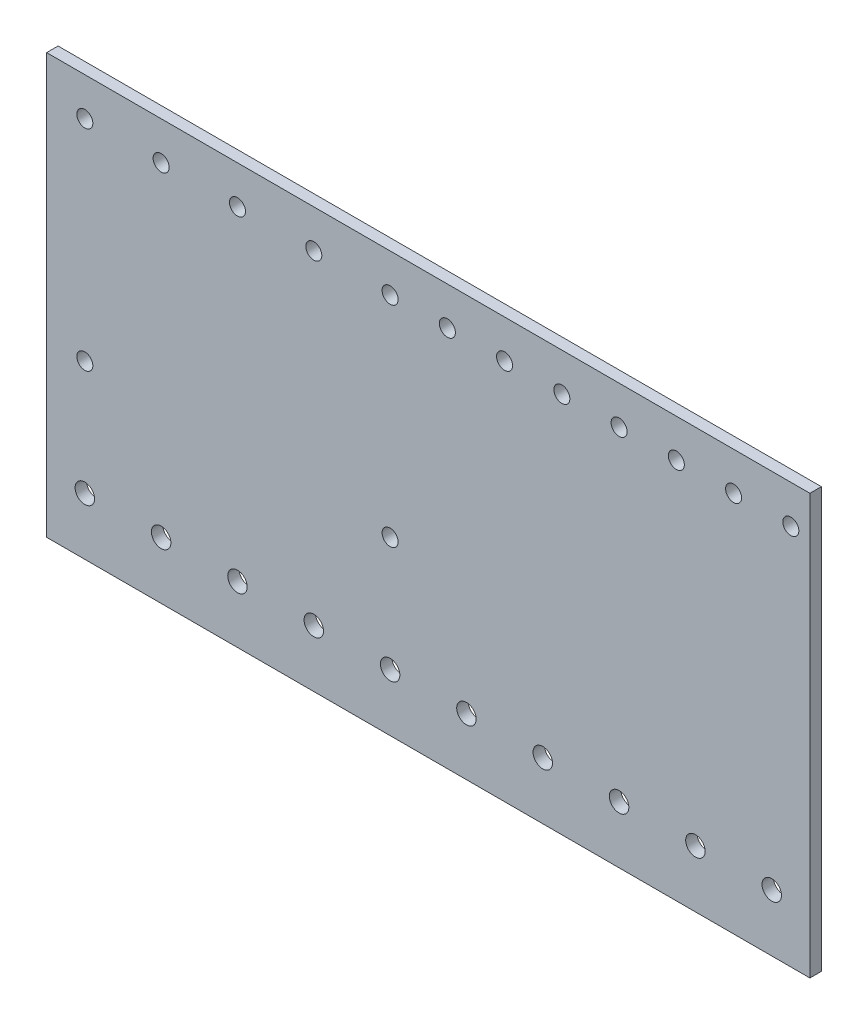
ISO-10303-21;
HEADER;
FILE_DESCRIPTION(('STEP AP214'),'2;1');
FILE_NAME('part.step','',(''),(''),'','','');
FILE_SCHEMA(('AUTOMOTIVE_DESIGN { 1 0 10303 214 1 1 1 1 }'));
ENDSEC;
DATA;
#1=APPLICATION_CONTEXT('core data for automotive mechanical design processes');
#2=APPLICATION_PROTOCOL_DEFINITION('international standard','automotive_design',2000,#1);
#3=PRODUCT_CONTEXT('',#1,'mechanical');
#4=PRODUCT('Part','Part','',(#3));
#5=PRODUCT_RELATED_PRODUCT_CATEGORY('part','',(#4));
#6=PRODUCT_DEFINITION_FORMATION('','',#4);
#7=PRODUCT_DEFINITION_CONTEXT('part definition',#1,'design');
#8=PRODUCT_DEFINITION('design','',#6,#7);
#9=PRODUCT_DEFINITION_SHAPE('','',#8);
#10=(LENGTH_UNIT() NAMED_UNIT(*) SI_UNIT(.MILLI.,.METRE.));
#11=(NAMED_UNIT(*) PLANE_ANGLE_UNIT() SI_UNIT($,.RADIAN.));
#12=(NAMED_UNIT(*) SI_UNIT($,.STERADIAN.) SOLID_ANGLE_UNIT());
#13=UNCERTAINTY_MEASURE_WITH_UNIT(LENGTH_MEASURE(1.E-05),#10,'distance_accuracy_value','');
#14=(GEOMETRIC_REPRESENTATION_CONTEXT(3) GLOBAL_UNCERTAINTY_ASSIGNED_CONTEXT((#13)) GLOBAL_UNIT_ASSIGNED_CONTEXT((#10,
#11,#12)) REPRESENTATION_CONTEXT('',''));
#15=CARTESIAN_POINT('',(0.,0.,0.));
#16=DIRECTION('',(0.,0.,1.));
#17=DIRECTION('',(1.,0.,0.));
#18=AXIS2_PLACEMENT_3D('',#15,#16,#17);
#19=CARTESIAN_POINT('',(0.,0.,3.));
#20=DIRECTION('',(0.,0.,1.));
#21=DIRECTION('',(1.,0.,0.));
#22=AXIS2_PLACEMENT_3D('',#19,#20,#21);
#23=PLANE('',#22);
#24=DIRECTION('',(1.,0.,0.));
#25=VECTOR('',#24,1.);
#26=CARTESIAN_POINT('',(150.,-45.,3.));
#27=LINE('',#26,#25);
#28=CARTESIAN_POINT('',(-50.,-45.,3.));
#29=VERTEX_POINT('',#28);
#30=CARTESIAN_POINT('',(150.,-45.,3.));
#31=VERTEX_POINT('',#30);
#32=EDGE_CURVE('E83',#29,#31,#27,.T.);
#33=ORIENTED_EDGE('',*,*,#32,.T.);
#34=DIRECTION('',(0.,1.,0.));
#35=VECTOR('',#34,1.);
#36=CARTESIAN_POINT('',(150.,-65.,3.));
#37=LINE('',#36,#35);
#38=CARTESIAN_POINT('',(150.,65.,3.));
#39=VERTEX_POINT('',#38);
#40=EDGE_CURVE('E199',#31,#39,#37,.T.);
#41=ORIENTED_EDGE('',*,*,#40,.T.);
#42=DIRECTION('',(-1.,0.,0.));
#43=VECTOR('',#42,1.);
#44=CARTESIAN_POINT('',(-50.,65.,3.));
#45=LINE('',#44,#43);
#46=CARTESIAN_POINT('',(-50.,65.,3.));
#47=VERTEX_POINT('',#46);
#48=EDGE_CURVE('E67',#39,#47,#45,.T.);
#49=ORIENTED_EDGE('',*,*,#48,.T.);
#50=DIRECTION('',(0.,-1.,0.));
#51=VECTOR('',#50,1.);
#52=CARTESIAN_POINT('',(-50.,65.,3.));
#53=LINE('',#52,#51);
#54=EDGE_CURVE('E50',#47,#29,#53,.T.);
#55=ORIENTED_EDGE('',*,*,#54,.T.);
#56=EDGE_LOOP('',(#33,#41,#49,#55));
#57=FACE_BOUND('',#56,.T.);
#58=CARTESIAN_POINT('',(140.,-30.,3.));
#59=DIRECTION('',(0.,0.,-1.));
#60=DIRECTION('',(-1.,0.,0.));
#61=AXIS2_PLACEMENT_3D('',#58,#59,#60);
#62=CIRCLE('',#61,2.54999999999999);
#63=CARTESIAN_POINT('',(137.45,-30.,3.));
#64=VERTEX_POINT('',#63);
#65=EDGE_CURVE('E117',#64,#64,#62,.T.);
#66=ORIENTED_EDGE('',*,*,#65,.T.);
#67=EDGE_LOOP('',(#66));
#68=FACE_BOUND('',#67,.T.);
#69=CARTESIAN_POINT('',(120.,-30.,3.));
#70=DIRECTION('',(0.,0.,-1.));
#71=DIRECTION('',(-1.,0.,0.));
#72=AXIS2_PLACEMENT_3D('',#69,#70,#71);
#73=CIRCLE('',#72,2.54999999999999);
#74=CARTESIAN_POINT('',(117.45,-30.,3.));
#75=VERTEX_POINT('',#74);
#76=EDGE_CURVE('E314',#75,#75,#73,.T.);
#77=ORIENTED_EDGE('',*,*,#76,.T.);
#78=EDGE_LOOP('',(#77));
#79=FACE_BOUND('',#78,.T.);
#80=CARTESIAN_POINT('',(100.,-30.,3.));
#81=DIRECTION('',(0.,0.,-1.));
#82=DIRECTION('',(-1.,0.,0.));
#83=AXIS2_PLACEMENT_3D('',#80,#81,#82);
#84=CIRCLE('',#83,2.54999999999999);
#85=CARTESIAN_POINT('',(97.45,-30.,3.));
#86=VERTEX_POINT('',#85);
#87=EDGE_CURVE('E318',#86,#86,#84,.T.);
#88=ORIENTED_EDGE('',*,*,#87,.T.);
#89=EDGE_LOOP('',(#88));
#90=FACE_BOUND('',#89,.T.);
#91=CARTESIAN_POINT('',(80.,-30.,3.));
#92=DIRECTION('',(0.,0.,-1.));
#93=DIRECTION('',(-1.,0.,0.));
#94=AXIS2_PLACEMENT_3D('',#91,#92,#93);
#95=CIRCLE('',#94,2.54999999999999);
#96=CARTESIAN_POINT('',(77.45,-30.,3.));
#97=VERTEX_POINT('',#96);
#98=EDGE_CURVE('E322',#97,#97,#95,.T.);
#99=ORIENTED_EDGE('',*,*,#98,.T.);
#100=EDGE_LOOP('',(#99));
#101=FACE_BOUND('',#100,.T.);
#102=CARTESIAN_POINT('',(60.,-30.,3.));
#103=DIRECTION('',(0.,0.,-1.));
#104=DIRECTION('',(-1.,0.,0.));
#105=AXIS2_PLACEMENT_3D('',#102,#103,#104);
#106=CIRCLE('',#105,2.54999999999999);
#107=CARTESIAN_POINT('',(57.45,-30.,3.));
#108=VERTEX_POINT('',#107);
#109=EDGE_CURVE('E326',#108,#108,#106,.T.);
#110=ORIENTED_EDGE('',*,*,#109,.T.);
#111=EDGE_LOOP('',(#110));
#112=FACE_BOUND('',#111,.T.);
#113=CARTESIAN_POINT('',(40.,-30.,3.));
#114=DIRECTION('',(0.,0.,-1.));
#115=DIRECTION('',(-1.,0.,0.));
#116=AXIS2_PLACEMENT_3D('',#113,#114,#115);
#117=CIRCLE('',#116,2.54999999999999);
#118=CARTESIAN_POINT('',(37.45,-30.,3.));
#119=VERTEX_POINT('',#118);
#120=EDGE_CURVE('E330',#119,#119,#117,.T.);
#121=ORIENTED_EDGE('',*,*,#120,.T.);
#122=EDGE_LOOP('',(#121));
#123=FACE_BOUND('',#122,.T.);
#124=CARTESIAN_POINT('',(20.,-30.,3.));
#125=DIRECTION('',(0.,0.,-1.));
#126=DIRECTION('',(-1.,0.,0.));
#127=AXIS2_PLACEMENT_3D('',#124,#125,#126);
#128=CIRCLE('',#127,2.54999999999999);
#129=CARTESIAN_POINT('',(17.45,-30.,3.));
#130=VERTEX_POINT('',#129);
#131=EDGE_CURVE('E334',#130,#130,#128,.T.);
#132=ORIENTED_EDGE('',*,*,#131,.T.);
#133=EDGE_LOOP('',(#132));
#134=FACE_BOUND('',#133,.T.);
#135=CARTESIAN_POINT('',(0.,-30.,3.));
#136=DIRECTION('',(0.,0.,-1.));
#137=DIRECTION('',(-1.,0.,0.));
#138=AXIS2_PLACEMENT_3D('',#135,#136,#137);
#139=CIRCLE('',#138,2.54999999999999);
#140=CARTESIAN_POINT('',(-2.54999999999999,-30.,3.));
#141=VERTEX_POINT('',#140);
#142=EDGE_CURVE('E338',#141,#141,#139,.T.);
#143=ORIENTED_EDGE('',*,*,#142,.T.);
#144=EDGE_LOOP('',(#143));
#145=FACE_BOUND('',#144,.T.);
#146=CARTESIAN_POINT('',(-20.,-30.,3.));
#147=DIRECTION('',(0.,0.,-1.));
#148=DIRECTION('',(-1.,0.,0.));
#149=AXIS2_PLACEMENT_3D('',#146,#147,#148);
#150=CIRCLE('',#149,2.54999999999999);
#151=CARTESIAN_POINT('',(-22.55,-30.,3.));
#152=VERTEX_POINT('',#151);
#153=EDGE_CURVE('E307',#152,#152,#150,.T.);
#154=ORIENTED_EDGE('',*,*,#153,.T.);
#155=EDGE_LOOP('',(#154));
#156=FACE_BOUND('',#155,.T.);
#157=CARTESIAN_POINT('',(-40.,-30.,3.));
#158=DIRECTION('',(0.,0.,-1.));
#159=DIRECTION('',(-1.,0.,0.));
#160=AXIS2_PLACEMENT_3D('',#157,#158,#159);
#161=CIRCLE('',#160,2.54999999999999);
#162=CARTESIAN_POINT('',(-42.55,-30.,3.));
#163=VERTEX_POINT('',#162);
#164=EDGE_CURVE('E302',#163,#163,#161,.T.);
#165=ORIENTED_EDGE('',*,*,#164,.T.);
#166=EDGE_LOOP('',(#165));
#167=FACE_BOUND('',#166,.T.);
#168=CARTESIAN_POINT('',(69.9999999999994,55.,3.));
#169=DIRECTION('',(0.,0.,1.));
#170=DIRECTION('',(1.,0.,0.));
#171=AXIS2_PLACEMENT_3D('',#168,#169,#170);
#172=CIRCLE('',#171,2.09999999999999);
#173=CARTESIAN_POINT('',(72.0999999999994,55.,3.));
#174=VERTEX_POINT('',#173);
#175=EDGE_CURVE('E195',#174,#174,#172,.T.);
#176=ORIENTED_EDGE('',*,*,#175,.F.);
#177=EDGE_LOOP('',(#176));
#178=FACE_BOUND('',#177,.T.);
#179=CARTESIAN_POINT('',(84.9999999999994,55.,3.));
#180=DIRECTION('',(0.,0.,1.));
#181=DIRECTION('',(1.,0.,0.));
#182=AXIS2_PLACEMENT_3D('',#179,#180,#181);
#183=CIRCLE('',#182,2.09999999999999);
#184=CARTESIAN_POINT('',(87.0999999999994,55.,3.));
#185=VERTEX_POINT('',#184);
#186=EDGE_CURVE('E191',#185,#185,#183,.T.);
#187=ORIENTED_EDGE('',*,*,#186,.F.);
#188=EDGE_LOOP('',(#187));
#189=FACE_BOUND('',#188,.T.);
#190=CARTESIAN_POINT('',(99.9999999999994,55.,3.));
#191=DIRECTION('',(0.,0.,1.));
#192=DIRECTION('',(1.,0.,0.));
#193=AXIS2_PLACEMENT_3D('',#190,#191,#192);
#194=CIRCLE('',#193,2.09999999999999);
#195=CARTESIAN_POINT('',(102.099999999999,55.,3.));
#196=VERTEX_POINT('',#195);
#197=EDGE_CURVE('E187',#196,#196,#194,.T.);
#198=ORIENTED_EDGE('',*,*,#197,.F.);
#199=EDGE_LOOP('',(#198));
#200=FACE_BOUND('',#199,.T.);
#201=CARTESIAN_POINT('',(114.999999999999,55.,3.));
#202=DIRECTION('',(0.,0.,1.));
#203=DIRECTION('',(1.,0.,0.));
#204=AXIS2_PLACEMENT_3D('',#201,#202,#203);
#205=CIRCLE('',#204,2.09999999999999);
#206=CARTESIAN_POINT('',(117.099999999999,55.,3.));
#207=VERTEX_POINT('',#206);
#208=EDGE_CURVE('E183',#207,#207,#205,.T.);
#209=ORIENTED_EDGE('',*,*,#208,.F.);
#210=EDGE_LOOP('',(#209));
#211=FACE_BOUND('',#210,.T.);
#212=CARTESIAN_POINT('',(129.999999999999,55.,3.));
#213=DIRECTION('',(0.,0.,1.));
#214=DIRECTION('',(1.,0.,0.));
#215=AXIS2_PLACEMENT_3D('',#212,#213,#214);
#216=CIRCLE('',#215,2.09999999999999);
#217=CARTESIAN_POINT('',(132.099999999999,55.,3.));
#218=VERTEX_POINT('',#217);
#219=EDGE_CURVE('E179',#218,#218,#216,.T.);
#220=ORIENTED_EDGE('',*,*,#219,.F.);
#221=EDGE_LOOP('',(#220));
#222=FACE_BOUND('',#221,.T.);
#223=CARTESIAN_POINT('',(144.999999999999,55.,3.));
#224=DIRECTION('',(0.,0.,1.));
#225=DIRECTION('',(1.,0.,0.));
#226=AXIS2_PLACEMENT_3D('',#223,#224,#225);
#227=CIRCLE('',#226,2.09999999999999);
#228=CARTESIAN_POINT('',(147.099999999999,55.,3.));
#229=VERTEX_POINT('',#228);
#230=EDGE_CURVE('E175',#229,#229,#227,.T.);
#231=ORIENTED_EDGE('',*,*,#230,.F.);
#232=EDGE_LOOP('',(#231));
#233=FACE_BOUND('',#232,.T.);
#234=CARTESIAN_POINT('',(54.9999999999994,55.,3.));
#235=DIRECTION('',(0.,0.,1.));
#236=DIRECTION('',(1.,0.,0.));
#237=AXIS2_PLACEMENT_3D('',#234,#235,#236);
#238=CIRCLE('',#237,2.09999999999999);
#239=CARTESIAN_POINT('',(57.0999999999994,55.,3.));
#240=VERTEX_POINT('',#239);
#241=EDGE_CURVE('E170',#240,#240,#238,.T.);
#242=ORIENTED_EDGE('',*,*,#241,.F.);
#243=EDGE_LOOP('',(#242));
#244=FACE_BOUND('',#243,.T.);
#245=CARTESIAN_POINT('',(40.0000000000006,0.,3.));
#246=DIRECTION('',(0.,0.,-1.));
#247=DIRECTION('',(-1.,0.,0.));
#248=AXIS2_PLACEMENT_3D('',#245,#246,#247);
#249=CIRCLE('',#248,2.09999999999999);
#250=CARTESIAN_POINT('',(37.9000000000006,0.,3.));
#251=VERTEX_POINT('',#250);
#252=EDGE_CURVE('E109',#251,#251,#249,.T.);
#253=ORIENTED_EDGE('',*,*,#252,.T.);
#254=EDGE_LOOP('',(#253));
#255=FACE_BOUND('',#254,.T.);
#256=CARTESIAN_POINT('',(-5.759281940243E-13,55.,3.));
#257=DIRECTION('',(0.,0.,1.));
#258=DIRECTION('',(1.,0.,0.));
#259=AXIS2_PLACEMENT_3D('',#256,#257,#258);
#260=CIRCLE('',#259,2.09999999999999);
#261=CARTESIAN_POINT('',(2.09999999999941,55.,3.));
#262=VERTEX_POINT('',#261);
#263=EDGE_CURVE('E219',#262,#262,#260,.T.);
#264=ORIENTED_EDGE('',*,*,#263,.F.);
#265=EDGE_LOOP('',(#264));
#266=FACE_BOUND('',#265,.T.);
#267=CARTESIAN_POINT('',(-20.0000000000006,55.,3.));
#268=DIRECTION('',(0.,0.,1.));
#269=DIRECTION('',(1.,0.,0.));
#270=AXIS2_PLACEMENT_3D('',#267,#268,#269);
#271=CIRCLE('',#270,2.09999999999999);
#272=CARTESIAN_POINT('',(-17.9000000000006,55.,3.));
#273=VERTEX_POINT('',#272);
#274=EDGE_CURVE('E228',#273,#273,#271,.T.);
#275=ORIENTED_EDGE('',*,*,#274,.F.);
#276=EDGE_LOOP('',(#275));
#277=FACE_BOUND('',#276,.T.);
#278=CARTESIAN_POINT('',(-40.0000000000006,54.9999999999992,3.));
#279=DIRECTION('',(0.,0.,1.));
#280=DIRECTION('',(1.,0.,0.));
#281=AXIS2_PLACEMENT_3D('',#278,#279,#280);
#282=CIRCLE('',#281,2.1);
#283=CARTESIAN_POINT('',(-37.9000000000006,54.9999999999992,3.));
#284=VERTEX_POINT('',#283);
#285=EDGE_CURVE('E236',#284,#284,#282,.T.);
#286=ORIENTED_EDGE('',*,*,#285,.F.);
#287=EDGE_LOOP('',(#286));
#288=FACE_BOUND('',#287,.T.);
#289=CARTESIAN_POINT('',(-40.0000000000006,-8.33056934125775E-13,3.));
#290=DIRECTION('',(0.,0.,1.));
#291=DIRECTION('',(1.,0.,0.));
#292=AXIS2_PLACEMENT_3D('',#289,#290,#291);
#293=CIRCLE('',#292,2.1);
#294=CARTESIAN_POINT('',(-37.9000000000006,-8.33056934125775E-13,3.));
#295=VERTEX_POINT('',#294);
#296=EDGE_CURVE('E244',#295,#295,#293,.T.);
#297=ORIENTED_EDGE('',*,*,#296,.F.);
#298=EDGE_LOOP('',(#297));
#299=FACE_BOUND('',#298,.T.);
#300=CARTESIAN_POINT('',(39.9999999999994,55.,3.));
#301=DIRECTION('',(0.,0.,1.));
#302=DIRECTION('',(1.,0.,0.));
#303=AXIS2_PLACEMENT_3D('',#300,#301,#302);
#304=CIRCLE('',#303,2.09999999999999);
#305=CARTESIAN_POINT('',(42.0999999999994,55.,3.));
#306=VERTEX_POINT('',#305);
#307=EDGE_CURVE('E211',#306,#306,#304,.T.);
#308=ORIENTED_EDGE('',*,*,#307,.F.);
#309=EDGE_LOOP('',(#308));
#310=FACE_BOUND('',#309,.T.);
#311=CARTESIAN_POINT('',(19.9999999999994,55.,3.));
#312=DIRECTION('',(0.,0.,1.));
#313=DIRECTION('',(1.,0.,0.));
#314=AXIS2_PLACEMENT_3D('',#311,#312,#313);
#315=CIRCLE('',#314,2.09999999999999);
#316=CARTESIAN_POINT('',(22.0999999999994,55.,3.));
#317=VERTEX_POINT('',#316);
#318=EDGE_CURVE('E258',#317,#317,#315,.T.);
#319=ORIENTED_EDGE('',*,*,#318,.F.);
#320=EDGE_LOOP('',(#319));
#321=FACE_BOUND('',#320,.T.);
#322=ADVANCED_FACE('F40',(#57,#68,#79,#90,#101,#112,#123,#134,#145,#156,#167,#178,#189,#200,
#211,#222,#233,#244,#255,#266,#277,#288,#299,#310,#321),#23,.T.);
#323=CARTESIAN_POINT('',(0.,0.,0.));
#324=DIRECTION('',(0.,0.,1.));
#325=DIRECTION('',(1.,0.,0.));
#326=AXIS2_PLACEMENT_3D('',#323,#324,#325);
#327=PLANE('',#326);
#328=CARTESIAN_POINT('',(140.,-30.,0.));
#329=DIRECTION('',(0.,0.,1.));
#330=DIRECTION('',(1.,0.,0.));
#331=AXIS2_PLACEMENT_3D('',#328,#329,#330);
#332=CIRCLE('',#331,2.54999999999999);
#333=CARTESIAN_POINT('',(142.55,-30.,0.));
#334=VERTEX_POINT('',#333);
#335=EDGE_CURVE('E44',#334,#334,#332,.T.);
#336=ORIENTED_EDGE('',*,*,#335,.T.);
#337=EDGE_LOOP('',(#336));
#338=FACE_BOUND('',#337,.T.);
#339=CARTESIAN_POINT('',(120.,-30.,0.));
#340=DIRECTION('',(0.,0.,1.));
#341=DIRECTION('',(1.,0.,0.));
#342=AXIS2_PLACEMENT_3D('',#339,#340,#341);
#343=CIRCLE('',#342,2.54999999999999);
#344=CARTESIAN_POINT('',(122.55,-30.,0.));
#345=VERTEX_POINT('',#344);
#346=EDGE_CURVE('E144',#345,#345,#343,.T.);
#347=ORIENTED_EDGE('',*,*,#346,.T.);
#348=EDGE_LOOP('',(#347));
#349=FACE_BOUND('',#348,.T.);
#350=CARTESIAN_POINT('',(100.,-30.,0.));
#351=DIRECTION('',(0.,0.,1.));
#352=DIRECTION('',(1.,0.,0.));
#353=AXIS2_PLACEMENT_3D('',#350,#351,#352);
#354=CIRCLE('',#353,2.54999999999999);
#355=CARTESIAN_POINT('',(102.55,-30.,0.));
#356=VERTEX_POINT('',#355);
#357=EDGE_CURVE('E141',#356,#356,#354,.T.);
#358=ORIENTED_EDGE('',*,*,#357,.T.);
#359=EDGE_LOOP('',(#358));
#360=FACE_BOUND('',#359,.T.);
#361=CARTESIAN_POINT('',(80.,-30.,0.));
#362=DIRECTION('',(0.,0.,1.));
#363=DIRECTION('',(1.,0.,0.));
#364=AXIS2_PLACEMENT_3D('',#361,#362,#363);
#365=CIRCLE('',#364,2.54999999999999);
#366=CARTESIAN_POINT('',(82.55,-30.,0.));
#367=VERTEX_POINT('',#366);
#368=EDGE_CURVE('E137',#367,#367,#365,.T.);
#369=ORIENTED_EDGE('',*,*,#368,.T.);
#370=EDGE_LOOP('',(#369));
#371=FACE_BOUND('',#370,.T.);
#372=CARTESIAN_POINT('',(60.,-30.,0.));
#373=DIRECTION('',(0.,0.,1.));
#374=DIRECTION('',(1.,0.,0.));
#375=AXIS2_PLACEMENT_3D('',#372,#373,#374);
#376=CIRCLE('',#375,2.54999999999999);
#377=CARTESIAN_POINT('',(62.55,-30.,0.));
#378=VERTEX_POINT('',#377);
#379=EDGE_CURVE('E133',#378,#378,#376,.T.);
#380=ORIENTED_EDGE('',*,*,#379,.T.);
#381=EDGE_LOOP('',(#380));
#382=FACE_BOUND('',#381,.T.);
#383=CARTESIAN_POINT('',(40.,-30.,0.));
#384=DIRECTION('',(0.,0.,1.));
#385=DIRECTION('',(1.,0.,0.));
#386=AXIS2_PLACEMENT_3D('',#383,#384,#385);
#387=CIRCLE('',#386,2.54999999999999);
#388=CARTESIAN_POINT('',(42.55,-30.,0.));
#389=VERTEX_POINT('',#388);
#390=EDGE_CURVE('E129',#389,#389,#387,.T.);
#391=ORIENTED_EDGE('',*,*,#390,.T.);
#392=EDGE_LOOP('',(#391));
#393=FACE_BOUND('',#392,.T.);
#394=CARTESIAN_POINT('',(20.,-30.,0.));
#395=DIRECTION('',(0.,0.,1.));
#396=DIRECTION('',(1.,0.,0.));
#397=AXIS2_PLACEMENT_3D('',#394,#395,#396);
#398=CIRCLE('',#397,2.54999999999999);
#399=CARTESIAN_POINT('',(22.55,-30.,0.));
#400=VERTEX_POINT('',#399);
#401=EDGE_CURVE('E125',#400,#400,#398,.T.);
#402=ORIENTED_EDGE('',*,*,#401,.T.);
#403=EDGE_LOOP('',(#402));
#404=FACE_BOUND('',#403,.T.);
#405=CARTESIAN_POINT('',(0.,-30.,0.));
#406=DIRECTION('',(0.,0.,1.));
#407=DIRECTION('',(1.,0.,0.));
#408=AXIS2_PLACEMENT_3D('',#405,#406,#407);
#409=CIRCLE('',#408,2.54999999999999);
#410=CARTESIAN_POINT('',(2.54999999999999,-30.,0.));
#411=VERTEX_POINT('',#410);
#412=EDGE_CURVE('E121',#411,#411,#409,.T.);
#413=ORIENTED_EDGE('',*,*,#412,.T.);
#414=EDGE_LOOP('',(#413));
#415=FACE_BOUND('',#414,.T.);
#416=CARTESIAN_POINT('',(-20.,-30.,0.));
#417=DIRECTION('',(0.,0.,1.));
#418=DIRECTION('',(1.,0.,0.));
#419=AXIS2_PLACEMENT_3D('',#416,#417,#418);
#420=CIRCLE('',#419,2.54999999999999);
#421=CARTESIAN_POINT('',(-17.45,-30.,0.));
#422=VERTEX_POINT('',#421);
#423=EDGE_CURVE('E116',#422,#422,#420,.T.);
#424=ORIENTED_EDGE('',*,*,#423,.T.);
#425=EDGE_LOOP('',(#424));
#426=FACE_BOUND('',#425,.T.);
#427=CARTESIAN_POINT('',(-40.,-30.,0.));
#428=DIRECTION('',(0.,0.,1.));
#429=DIRECTION('',(1.,0.,0.));
#430=AXIS2_PLACEMENT_3D('',#427,#428,#429);
#431=CIRCLE('',#430,2.54999999999999);
#432=CARTESIAN_POINT('',(-37.45,-30.,0.));
#433=VERTEX_POINT('',#432);
#434=EDGE_CURVE('E112',#433,#433,#431,.T.);
#435=ORIENTED_EDGE('',*,*,#434,.T.);
#436=EDGE_LOOP('',(#435));
#437=FACE_BOUND('',#436,.T.);
#438=CARTESIAN_POINT('',(69.9999999999994,55.,0.));
#439=DIRECTION('',(0.,0.,1.));
#440=DIRECTION('',(1.,0.,0.));
#441=AXIS2_PLACEMENT_3D('',#438,#439,#440);
#442=CIRCLE('',#441,2.09999999999999);
#443=CARTESIAN_POINT('',(72.0999999999994,55.,0.));
#444=VERTEX_POINT('',#443);
#445=EDGE_CURVE('E171',#444,#444,#442,.T.);
#446=ORIENTED_EDGE('',*,*,#445,.T.);
#447=EDGE_LOOP('',(#446));
#448=FACE_BOUND('',#447,.T.);
#449=CARTESIAN_POINT('',(84.9999999999994,55.,0.));
#450=DIRECTION('',(0.,0.,1.));
#451=DIRECTION('',(1.,0.,0.));
#452=AXIS2_PLACEMENT_3D('',#449,#450,#451);
#453=CIRCLE('',#452,2.09999999999999);
#454=CARTESIAN_POINT('',(87.0999999999994,55.,0.));
#455=VERTEX_POINT('',#454);
#456=EDGE_CURVE('E348',#455,#455,#453,.T.);
#457=ORIENTED_EDGE('',*,*,#456,.T.);
#458=EDGE_LOOP('',(#457));
#459=FACE_BOUND('',#458,.T.);
#460=CARTESIAN_POINT('',(99.9999999999994,55.,0.));
#461=DIRECTION('',(0.,0.,1.));
#462=DIRECTION('',(1.,0.,0.));
#463=AXIS2_PLACEMENT_3D('',#460,#461,#462);
#464=CIRCLE('',#463,2.09999999999999);
#465=CARTESIAN_POINT('',(102.099999999999,55.,0.));
#466=VERTEX_POINT('',#465);
#467=EDGE_CURVE('E352',#466,#466,#464,.T.);
#468=ORIENTED_EDGE('',*,*,#467,.T.);
#469=EDGE_LOOP('',(#468));
#470=FACE_BOUND('',#469,.T.);
#471=CARTESIAN_POINT('',(114.999999999999,55.,0.));
#472=DIRECTION('',(0.,0.,1.));
#473=DIRECTION('',(1.,0.,0.));
#474=AXIS2_PLACEMENT_3D('',#471,#472,#473);
#475=CIRCLE('',#474,2.09999999999999);
#476=CARTESIAN_POINT('',(117.099999999999,55.,0.));
#477=VERTEX_POINT('',#476);
#478=EDGE_CURVE('E162',#477,#477,#475,.T.);
#479=ORIENTED_EDGE('',*,*,#478,.T.);
#480=EDGE_LOOP('',(#479));
#481=FACE_BOUND('',#480,.T.);
#482=CARTESIAN_POINT('',(129.999999999999,55.,0.));
#483=DIRECTION('',(0.,0.,1.));
#484=DIRECTION('',(1.,0.,0.));
#485=AXIS2_PLACEMENT_3D('',#482,#483,#484);
#486=CIRCLE('',#485,2.09999999999999);
#487=CARTESIAN_POINT('',(132.099999999999,55.,0.));
#488=VERTEX_POINT('',#487);
#489=EDGE_CURVE('E156',#488,#488,#486,.T.);
#490=ORIENTED_EDGE('',*,*,#489,.T.);
#491=EDGE_LOOP('',(#490));
#492=FACE_BOUND('',#491,.T.);
#493=CARTESIAN_POINT('',(144.999999999999,55.,0.));
#494=DIRECTION('',(0.,0.,1.));
#495=DIRECTION('',(1.,0.,0.));
#496=AXIS2_PLACEMENT_3D('',#493,#494,#495);
#497=CIRCLE('',#496,2.09999999999999);
#498=CARTESIAN_POINT('',(147.099999999999,55.,0.));
#499=VERTEX_POINT('',#498);
#500=EDGE_CURVE('E151',#499,#499,#497,.T.);
#501=ORIENTED_EDGE('',*,*,#500,.T.);
#502=EDGE_LOOP('',(#501));
#503=FACE_BOUND('',#502,.T.);
#504=CARTESIAN_POINT('',(54.9999999999994,55.,0.));
#505=DIRECTION('',(0.,0.,1.));
#506=DIRECTION('',(1.,0.,0.));
#507=AXIS2_PLACEMENT_3D('',#504,#505,#506);
#508=CIRCLE('',#507,2.09999999999999);
#509=CARTESIAN_POINT('',(57.0999999999994,55.,0.));
#510=VERTEX_POINT('',#509);
#511=EDGE_CURVE('E166',#510,#510,#508,.T.);
#512=ORIENTED_EDGE('',*,*,#511,.T.);
#513=EDGE_LOOP('',(#512));
#514=FACE_BOUND('',#513,.T.);
#515=CARTESIAN_POINT('',(39.9999999999994,55.,0.));
#516=DIRECTION('',(0.,0.,1.));
#517=DIRECTION('',(1.,0.,0.));
#518=AXIS2_PLACEMENT_3D('',#515,#516,#517);
#519=CIRCLE('',#518,2.09999999999999);
#520=CARTESIAN_POINT('',(42.0999999999994,55.,0.));
#521=VERTEX_POINT('',#520);
#522=EDGE_CURVE('E204',#521,#521,#519,.T.);
#523=ORIENTED_EDGE('',*,*,#522,.T.);
#524=EDGE_LOOP('',(#523));
#525=FACE_BOUND('',#524,.T.);
#526=CARTESIAN_POINT('',(-40.0000000000006,-8.33056934125775E-13,0.));
#527=DIRECTION('',(0.,0.,1.));
#528=DIRECTION('',(1.,0.,0.));
#529=AXIS2_PLACEMENT_3D('',#526,#527,#528);
#530=CIRCLE('',#529,2.1);
#531=CARTESIAN_POINT('',(-37.9000000000006,-8.33056934125775E-13,0.));
#532=VERTEX_POINT('',#531);
#533=EDGE_CURVE('E215',#532,#532,#530,.T.);
#534=ORIENTED_EDGE('',*,*,#533,.T.);
#535=EDGE_LOOP('',(#534));
#536=FACE_BOUND('',#535,.T.);
#537=CARTESIAN_POINT('',(-20.0000000000006,55.,0.));
#538=DIRECTION('',(0.,0.,1.));
#539=DIRECTION('',(1.,0.,0.));
#540=AXIS2_PLACEMENT_3D('',#537,#538,#539);
#541=CIRCLE('',#540,2.09999999999999);
#542=CARTESIAN_POINT('',(-17.9000000000006,55.,0.));
#543=VERTEX_POINT('',#542);
#544=EDGE_CURVE('E232',#543,#543,#541,.T.);
#545=ORIENTED_EDGE('',*,*,#544,.T.);
#546=EDGE_LOOP('',(#545));
#547=FACE_BOUND('',#546,.T.);
#548=DIRECTION('',(0.,-1.,0.));
#549=VECTOR('',#548,1.);
#550=CARTESIAN_POINT('',(150.,-65.,0.));
#551=LINE('',#550,#549);
#552=CARTESIAN_POINT('',(150.,65.,0.));
#553=VERTEX_POINT('',#552);
#554=CARTESIAN_POINT('',(150.,-45.,0.));
#555=VERTEX_POINT('',#554);
#556=EDGE_CURVE('E200',#553,#555,#551,.T.);
#557=ORIENTED_EDGE('',*,*,#556,.T.);
#558=DIRECTION('',(-1.,0.,0.));
#559=VECTOR('',#558,1.);
#560=CARTESIAN_POINT('',(0.,-45.,0.));
#561=LINE('',#560,#559);
#562=CARTESIAN_POINT('',(-50.,-45.,0.));
#563=VERTEX_POINT('',#562);
#564=EDGE_CURVE('E58',#555,#563,#561,.T.);
#565=ORIENTED_EDGE('',*,*,#564,.T.);
#566=DIRECTION('',(0.,-1.,0.));
#567=VECTOR('',#566,1.);
#568=CARTESIAN_POINT('',(-50.,65.,0.));
#569=LINE('',#568,#567);
#570=CARTESIAN_POINT('',(-50.,65.,0.));
#571=VERTEX_POINT('',#570);
#572=EDGE_CURVE('E96',#571,#563,#569,.T.);
#573=ORIENTED_EDGE('',*,*,#572,.F.);
#574=DIRECTION('',(-1.,0.,0.));
#575=VECTOR('',#574,1.);
#576=CARTESIAN_POINT('',(-50.,65.,0.));
#577=LINE('',#576,#575);
#578=EDGE_CURVE('E106',#553,#571,#577,.T.);
#579=ORIENTED_EDGE('',*,*,#578,.F.);
#580=EDGE_LOOP('',(#557,#565,#573,#579));
#581=FACE_BOUND('',#580,.T.);
#582=CARTESIAN_POINT('',(-5.759281940243E-13,55.,0.));
#583=DIRECTION('',(0.,0.,1.));
#584=DIRECTION('',(1.,0.,0.));
#585=AXIS2_PLACEMENT_3D('',#582,#583,#584);
#586=CIRCLE('',#585,2.09999999999999);
#587=CARTESIAN_POINT('',(2.09999999999941,55.,0.));
#588=VERTEX_POINT('',#587);
#589=EDGE_CURVE('E224',#588,#588,#586,.T.);
#590=ORIENTED_EDGE('',*,*,#589,.T.);
#591=EDGE_LOOP('',(#590));
#592=FACE_BOUND('',#591,.T.);
#593=CARTESIAN_POINT('',(-40.0000000000006,54.9999999999992,0.));
#594=DIRECTION('',(0.,0.,1.));
#595=DIRECTION('',(1.,0.,0.));
#596=AXIS2_PLACEMENT_3D('',#593,#594,#595);
#597=CIRCLE('',#596,2.1);
#598=CARTESIAN_POINT('',(-37.9000000000006,54.9999999999992,0.));
#599=VERTEX_POINT('',#598);
#600=EDGE_CURVE('E240',#599,#599,#597,.T.);
#601=ORIENTED_EDGE('',*,*,#600,.T.);
#602=EDGE_LOOP('',(#601));
#603=FACE_BOUND('',#602,.T.);
#604=CARTESIAN_POINT('',(40.0000000000006,0.,0.));
#605=DIRECTION('',(0.,0.,-1.));
#606=DIRECTION('',(-1.,0.,0.));
#607=AXIS2_PLACEMENT_3D('',#604,#605,#606);
#608=CIRCLE('',#607,2.09999999999999);
#609=CARTESIAN_POINT('',(37.9000000000006,0.,0.));
#610=VERTEX_POINT('',#609);
#611=EDGE_CURVE('E254',#610,#610,#608,.T.);
#612=ORIENTED_EDGE('',*,*,#611,.F.);
#613=EDGE_LOOP('',(#612));
#614=FACE_BOUND('',#613,.T.);
#615=CARTESIAN_POINT('',(19.9999999999994,55.,0.));
#616=DIRECTION('',(0.,0.,1.));
#617=DIRECTION('',(1.,0.,0.));
#618=AXIS2_PLACEMENT_3D('',#615,#616,#617);
#619=CIRCLE('',#618,2.09999999999999);
#620=CARTESIAN_POINT('',(22.0999999999994,55.,0.));
#621=VERTEX_POINT('',#620);
#622=EDGE_CURVE('E223',#621,#621,#619,.T.);
#623=ORIENTED_EDGE('',*,*,#622,.T.);
#624=EDGE_LOOP('',(#623));
#625=FACE_BOUND('',#624,.T.);
#626=ADVANCED_FACE('F265',(#338,#349,#360,#371,#382,#393,#404,#415,#426,#437,#448,#459,#470,
#481,#492,#503,#514,#525,#536,#547,#581,#592,#603,#614,#625),#327,.F.);
#627=CARTESIAN_POINT('',(-50.,65.,3.));
#628=DIRECTION('',(0.,-1.,0.));
#629=DIRECTION('',(0.,0.,-1.));
#630=AXIS2_PLACEMENT_3D('',#627,#628,#629);
#631=PLANE('',#630);
#632=ORIENTED_EDGE('',*,*,#578,.T.);
#633=DIRECTION('',(0.,0.,-1.));
#634=VECTOR('',#633,1.);
#635=CARTESIAN_POINT('',(-50.,65.,3.));
#636=LINE('',#635,#634);
#637=EDGE_CURVE('E11',#47,#571,#636,.T.);
#638=ORIENTED_EDGE('',*,*,#637,.F.);
#639=ORIENTED_EDGE('',*,*,#48,.F.);
#640=DIRECTION('',(0.,0.,1.));
#641=VECTOR('',#640,1.);
#642=CARTESIAN_POINT('',(150.,65.,-164.012194668567));
#643=LINE('',#642,#641);
#644=EDGE_CURVE('E205',#553,#39,#643,.T.);
#645=ORIENTED_EDGE('',*,*,#644,.F.);
#646=EDGE_LOOP('',(#632,#638,#639,#645));
#647=FACE_BOUND('',#646,.T.);
#648=ADVANCED_FACE('F42',(#647),#631,.F.);
#649=CARTESIAN_POINT('',(-50.,65.,3.));
#650=DIRECTION('',(1.,0.,0.));
#651=DIRECTION('',(0.,1.,0.));
#652=AXIS2_PLACEMENT_3D('',#649,#650,#651);
#653=PLANE('',#652);
#654=ORIENTED_EDGE('',*,*,#572,.T.);
#655=DIRECTION('',(0.,0.,-1.));
#656=VECTOR('',#655,1.);
#657=CARTESIAN_POINT('',(-50.,-45.,3.));
#658=LINE('',#657,#656);
#659=EDGE_CURVE('E86',#29,#563,#658,.T.);
#660=ORIENTED_EDGE('',*,*,#659,.F.);
#661=ORIENTED_EDGE('',*,*,#54,.F.);
#662=ORIENTED_EDGE('',*,*,#637,.T.);
#663=EDGE_LOOP('',(#654,#660,#661,#662));
#664=FACE_BOUND('',#663,.T.);
#665=ADVANCED_FACE('F94',(#664),#653,.F.);
#666=CARTESIAN_POINT('',(-5.759281940243E-13,55.,0.));
#667=DIRECTION('',(0.,0.,1.));
#668=DIRECTION('',(1.,0.,0.));
#669=AXIS2_PLACEMENT_3D('',#666,#667,#668);
#670=CYLINDRICAL_SURFACE('',#669,2.09999999999999);
#671=ORIENTED_EDGE('',*,*,#589,.F.);
#672=EDGE_LOOP('',(#671));
#673=FACE_BOUND('',#672,.T.);
#674=ORIENTED_EDGE('',*,*,#263,.T.);
#675=EDGE_LOOP('',(#674));
#676=FACE_BOUND('',#675,.T.);
#677=ADVANCED_FACE('F284',(#673,#676),#670,.F.);
#678=CARTESIAN_POINT('',(-20.0000000000006,55.,0.));
#679=DIRECTION('',(0.,0.,1.));
#680=DIRECTION('',(1.,0.,0.));
#681=AXIS2_PLACEMENT_3D('',#678,#679,#680);
#682=CYLINDRICAL_SURFACE('',#681,2.09999999999999);
#683=ORIENTED_EDGE('',*,*,#544,.F.);
#684=EDGE_LOOP('',(#683));
#685=FACE_BOUND('',#684,.T.);
#686=ORIENTED_EDGE('',*,*,#274,.T.);
#687=EDGE_LOOP('',(#686));
#688=FACE_BOUND('',#687,.T.);
#689=ADVANCED_FACE('F289',(#685,#688),#682,.F.);
#690=CARTESIAN_POINT('',(-40.0000000000006,54.9999999999992,0.));
#691=DIRECTION('',(0.,0.,1.));
#692=DIRECTION('',(1.,0.,0.));
#693=AXIS2_PLACEMENT_3D('',#690,#691,#692);
#694=CYLINDRICAL_SURFACE('',#693,2.1);
#695=ORIENTED_EDGE('',*,*,#600,.F.);
#696=EDGE_LOOP('',(#695));
#697=FACE_BOUND('',#696,.T.);
#698=ORIENTED_EDGE('',*,*,#285,.T.);
#699=EDGE_LOOP('',(#698));
#700=FACE_BOUND('',#699,.T.);
#701=ADVANCED_FACE('F395',(#697,#700),#694,.F.);
#702=CARTESIAN_POINT('',(-40.0000000000006,-8.33056934125775E-13,0.));
#703=DIRECTION('',(0.,0.,1.));
#704=DIRECTION('',(1.,0.,0.));
#705=AXIS2_PLACEMENT_3D('',#702,#703,#704);
#706=CYLINDRICAL_SURFACE('',#705,2.1);
#707=ORIENTED_EDGE('',*,*,#533,.F.);
#708=EDGE_LOOP('',(#707));
#709=FACE_BOUND('',#708,.T.);
#710=ORIENTED_EDGE('',*,*,#296,.T.);
#711=EDGE_LOOP('',(#710));
#712=FACE_BOUND('',#711,.T.);
#713=ADVANCED_FACE('F390',(#709,#712),#706,.F.);
#714=CARTESIAN_POINT('',(39.9999999999994,55.,0.));
#715=DIRECTION('',(0.,0.,1.));
#716=DIRECTION('',(1.,0.,0.));
#717=AXIS2_PLACEMENT_3D('',#714,#715,#716);
#718=CYLINDRICAL_SURFACE('',#717,2.09999999999999);
#719=ORIENTED_EDGE('',*,*,#522,.F.);
#720=EDGE_LOOP('',(#719));
#721=FACE_BOUND('',#720,.T.);
#722=ORIENTED_EDGE('',*,*,#307,.T.);
#723=EDGE_LOOP('',(#722));
#724=FACE_BOUND('',#723,.T.);
#725=ADVANCED_FACE('F388',(#721,#724),#718,.F.);
#726=CARTESIAN_POINT('',(40.0000000000006,0.,0.));
#727=DIRECTION('',(0.,0.,1.));
#728=DIRECTION('',(1.,0.,0.));
#729=AXIS2_PLACEMENT_3D('',#726,#727,#728);
#730=CYLINDRICAL_SURFACE('',#729,2.09999999999999);
#731=ORIENTED_EDGE('',*,*,#611,.T.);
#732=EDGE_LOOP('',(#731));
#733=FACE_BOUND('',#732,.T.);
#734=ORIENTED_EDGE('',*,*,#252,.F.);
#735=EDGE_LOOP('',(#734));
#736=FACE_BOUND('',#735,.T.);
#737=ADVANCED_FACE('F271',(#733,#736),#730,.F.);
#738=CARTESIAN_POINT('',(19.9999999999994,55.,0.));
#739=DIRECTION('',(0.,0.,1.));
#740=DIRECTION('',(1.,0.,0.));
#741=AXIS2_PLACEMENT_3D('',#738,#739,#740);
#742=CYLINDRICAL_SURFACE('',#741,2.09999999999999);
#743=ORIENTED_EDGE('',*,*,#622,.F.);
#744=EDGE_LOOP('',(#743));
#745=FACE_BOUND('',#744,.T.);
#746=ORIENTED_EDGE('',*,*,#318,.T.);
#747=EDGE_LOOP('',(#746));
#748=FACE_BOUND('',#747,.T.);
#749=ADVANCED_FACE('F267',(#745,#748),#742,.F.);
#750=CARTESIAN_POINT('',(150.,-65.,-164.012194668567));
#751=DIRECTION('',(1.,0.,0.));
#752=DIRECTION('',(0.,0.,-1.));
#753=AXIS2_PLACEMENT_3D('',#750,#751,#752);
#754=PLANE('',#753);
#755=DIRECTION('',(0.,0.,-1.));
#756=VECTOR('',#755,1.);
#757=CARTESIAN_POINT('',(150.,-45.,3.));
#758=LINE('',#757,#756);
#759=EDGE_CURVE('E87',#31,#555,#758,.T.);
#760=ORIENTED_EDGE('',*,*,#759,.T.);
#761=ORIENTED_EDGE('',*,*,#556,.F.);
#762=ORIENTED_EDGE('',*,*,#644,.T.);
#763=ORIENTED_EDGE('',*,*,#40,.F.);
#764=EDGE_LOOP('',(#760,#761,#762,#763));
#765=FACE_BOUND('',#764,.T.);
#766=ADVANCED_FACE('F270',(#765),#754,.T.);
#767=CARTESIAN_POINT('',(54.9999999999994,55.,0.));
#768=DIRECTION('',(0.,0.,1.));
#769=DIRECTION('',(1.,0.,0.));
#770=AXIS2_PLACEMENT_3D('',#767,#768,#769);
#771=CYLINDRICAL_SURFACE('',#770,2.09999999999999);
#772=ORIENTED_EDGE('',*,*,#241,.T.);
#773=EDGE_LOOP('',(#772));
#774=FACE_BOUND('',#773,.T.);
#775=ORIENTED_EDGE('',*,*,#511,.F.);
#776=EDGE_LOOP('',(#775));
#777=FACE_BOUND('',#776,.T.);
#778=ADVANCED_FACE('F381',(#774,#777),#771,.F.);
#779=CARTESIAN_POINT('',(144.999999999999,55.,0.));
#780=DIRECTION('',(0.,0.,1.));
#781=DIRECTION('',(1.,0.,0.));
#782=AXIS2_PLACEMENT_3D('',#779,#780,#781);
#783=CYLINDRICAL_SURFACE('',#782,2.09999999999999);
#784=ORIENTED_EDGE('',*,*,#230,.T.);
#785=EDGE_LOOP('',(#784));
#786=FACE_BOUND('',#785,.T.);
#787=ORIENTED_EDGE('',*,*,#500,.F.);
#788=EDGE_LOOP('',(#787));
#789=FACE_BOUND('',#788,.T.);
#790=ADVANCED_FACE('F374',(#786,#789),#783,.F.);
#791=CARTESIAN_POINT('',(129.999999999999,55.,0.));
#792=DIRECTION('',(0.,0.,1.));
#793=DIRECTION('',(1.,0.,0.));
#794=AXIS2_PLACEMENT_3D('',#791,#792,#793);
#795=CYLINDRICAL_SURFACE('',#794,2.09999999999999);
#796=ORIENTED_EDGE('',*,*,#219,.T.);
#797=EDGE_LOOP('',(#796));
#798=FACE_BOUND('',#797,.T.);
#799=ORIENTED_EDGE('',*,*,#489,.F.);
#800=EDGE_LOOP('',(#799));
#801=FACE_BOUND('',#800,.T.);
#802=ADVANCED_FACE('F364',(#798,#801),#795,.F.);
#803=CARTESIAN_POINT('',(114.999999999999,55.,0.));
#804=DIRECTION('',(0.,0.,1.));
#805=DIRECTION('',(1.,0.,0.));
#806=AXIS2_PLACEMENT_3D('',#803,#804,#805);
#807=CYLINDRICAL_SURFACE('',#806,2.09999999999999);
#808=ORIENTED_EDGE('',*,*,#208,.T.);
#809=EDGE_LOOP('',(#808));
#810=FACE_BOUND('',#809,.T.);
#811=ORIENTED_EDGE('',*,*,#478,.F.);
#812=EDGE_LOOP('',(#811));
#813=FACE_BOUND('',#812,.T.);
#814=ADVANCED_FACE('F361',(#810,#813),#807,.F.);
#815=CARTESIAN_POINT('',(99.9999999999994,55.,0.));
#816=DIRECTION('',(0.,0.,1.));
#817=DIRECTION('',(1.,0.,0.));
#818=AXIS2_PLACEMENT_3D('',#815,#816,#817);
#819=CYLINDRICAL_SURFACE('',#818,2.09999999999999);
#820=ORIENTED_EDGE('',*,*,#197,.T.);
#821=EDGE_LOOP('',(#820));
#822=FACE_BOUND('',#821,.T.);
#823=ORIENTED_EDGE('',*,*,#467,.F.);
#824=EDGE_LOOP('',(#823));
#825=FACE_BOUND('',#824,.T.);
#826=ADVANCED_FACE('F363',(#822,#825),#819,.F.);
#827=CARTESIAN_POINT('',(84.9999999999994,55.,0.));
#828=DIRECTION('',(0.,0.,1.));
#829=DIRECTION('',(1.,0.,0.));
#830=AXIS2_PLACEMENT_3D('',#827,#828,#829);
#831=CYLINDRICAL_SURFACE('',#830,2.09999999999999);
#832=ORIENTED_EDGE('',*,*,#186,.T.);
#833=EDGE_LOOP('',(#832));
#834=FACE_BOUND('',#833,.T.);
#835=ORIENTED_EDGE('',*,*,#456,.F.);
#836=EDGE_LOOP('',(#835));
#837=FACE_BOUND('',#836,.T.);
#838=ADVANCED_FACE('F371',(#834,#837),#831,.F.);
#839=CARTESIAN_POINT('',(69.9999999999994,55.,0.));
#840=DIRECTION('',(0.,0.,1.));
#841=DIRECTION('',(1.,0.,0.));
#842=AXIS2_PLACEMENT_3D('',#839,#840,#841);
#843=CYLINDRICAL_SURFACE('',#842,2.09999999999999);
#844=ORIENTED_EDGE('',*,*,#175,.T.);
#845=EDGE_LOOP('',(#844));
#846=FACE_BOUND('',#845,.T.);
#847=ORIENTED_EDGE('',*,*,#445,.F.);
#848=EDGE_LOOP('',(#847));
#849=FACE_BOUND('',#848,.T.);
#850=ADVANCED_FACE('F471',(#846,#849),#843,.F.);
#851=CARTESIAN_POINT('',(-40.,-30.,3.));
#852=DIRECTION('',(0.,0.,-1.));
#853=DIRECTION('',(-1.,0.,0.));
#854=AXIS2_PLACEMENT_3D('',#851,#852,#853);
#855=CYLINDRICAL_SURFACE('',#854,2.54999999999999);
#856=ORIENTED_EDGE('',*,*,#164,.F.);
#857=EDGE_LOOP('',(#856));
#858=FACE_BOUND('',#857,.T.);
#859=ORIENTED_EDGE('',*,*,#434,.F.);
#860=EDGE_LOOP('',(#859));
#861=FACE_BOUND('',#860,.T.);
#862=ADVANCED_FACE('F480',(#858,#861),#855,.F.);
#863=CARTESIAN_POINT('',(-20.,-30.,3.));
#864=DIRECTION('',(0.,0.,-1.));
#865=DIRECTION('',(-1.,0.,0.));
#866=AXIS2_PLACEMENT_3D('',#863,#864,#865);
#867=CYLINDRICAL_SURFACE('',#866,2.54999999999999);
#868=ORIENTED_EDGE('',*,*,#153,.F.);
#869=EDGE_LOOP('',(#868));
#870=FACE_BOUND('',#869,.T.);
#871=ORIENTED_EDGE('',*,*,#423,.F.);
#872=EDGE_LOOP('',(#871));
#873=FACE_BOUND('',#872,.T.);
#874=ADVANCED_FACE('F490',(#870,#873),#867,.F.);
#875=CARTESIAN_POINT('',(0.,-30.,3.));
#876=DIRECTION('',(0.,0.,-1.));
#877=DIRECTION('',(-1.,0.,0.));
#878=AXIS2_PLACEMENT_3D('',#875,#876,#877);
#879=CYLINDRICAL_SURFACE('',#878,2.54999999999999);
#880=ORIENTED_EDGE('',*,*,#142,.F.);
#881=EDGE_LOOP('',(#880));
#882=FACE_BOUND('',#881,.T.);
#883=ORIENTED_EDGE('',*,*,#412,.F.);
#884=EDGE_LOOP('',(#883));
#885=FACE_BOUND('',#884,.T.);
#886=ADVANCED_FACE('F500',(#882,#885),#879,.F.);
#887=CARTESIAN_POINT('',(20.,-30.,3.));
#888=DIRECTION('',(0.,0.,-1.));
#889=DIRECTION('',(-1.,0.,0.));
#890=AXIS2_PLACEMENT_3D('',#887,#888,#889);
#891=CYLINDRICAL_SURFACE('',#890,2.54999999999999);
#892=ORIENTED_EDGE('',*,*,#131,.F.);
#893=EDGE_LOOP('',(#892));
#894=FACE_BOUND('',#893,.T.);
#895=ORIENTED_EDGE('',*,*,#401,.F.);
#896=EDGE_LOOP('',(#895));
#897=FACE_BOUND('',#896,.T.);
#898=ADVANCED_FACE('F510',(#894,#897),#891,.F.);
#899=CARTESIAN_POINT('',(40.,-30.,3.));
#900=DIRECTION('',(0.,0.,-1.));
#901=DIRECTION('',(-1.,0.,0.));
#902=AXIS2_PLACEMENT_3D('',#899,#900,#901);
#903=CYLINDRICAL_SURFACE('',#902,2.54999999999999);
#904=ORIENTED_EDGE('',*,*,#120,.F.);
#905=EDGE_LOOP('',(#904));
#906=FACE_BOUND('',#905,.T.);
#907=ORIENTED_EDGE('',*,*,#390,.F.);
#908=EDGE_LOOP('',(#907));
#909=FACE_BOUND('',#908,.T.);
#910=ADVANCED_FACE('F520',(#906,#909),#903,.F.);
#911=CARTESIAN_POINT('',(60.,-30.,3.));
#912=DIRECTION('',(0.,0.,-1.));
#913=DIRECTION('',(-1.,0.,0.));
#914=AXIS2_PLACEMENT_3D('',#911,#912,#913);
#915=CYLINDRICAL_SURFACE('',#914,2.54999999999999);
#916=ORIENTED_EDGE('',*,*,#109,.F.);
#917=EDGE_LOOP('',(#916));
#918=FACE_BOUND('',#917,.T.);
#919=ORIENTED_EDGE('',*,*,#379,.F.);
#920=EDGE_LOOP('',(#919));
#921=FACE_BOUND('',#920,.T.);
#922=ADVANCED_FACE('F530',(#918,#921),#915,.F.);
#923=CARTESIAN_POINT('',(80.,-30.,3.));
#924=DIRECTION('',(0.,0.,-1.));
#925=DIRECTION('',(-1.,0.,0.));
#926=AXIS2_PLACEMENT_3D('',#923,#924,#925);
#927=CYLINDRICAL_SURFACE('',#926,2.54999999999999);
#928=ORIENTED_EDGE('',*,*,#98,.F.);
#929=EDGE_LOOP('',(#928));
#930=FACE_BOUND('',#929,.T.);
#931=ORIENTED_EDGE('',*,*,#368,.F.);
#932=EDGE_LOOP('',(#931));
#933=FACE_BOUND('',#932,.T.);
#934=ADVANCED_FACE('F540',(#930,#933),#927,.F.);
#935=CARTESIAN_POINT('',(100.,-30.,3.));
#936=DIRECTION('',(0.,0.,-1.));
#937=DIRECTION('',(-1.,0.,0.));
#938=AXIS2_PLACEMENT_3D('',#935,#936,#937);
#939=CYLINDRICAL_SURFACE('',#938,2.54999999999999);
#940=ORIENTED_EDGE('',*,*,#87,.F.);
#941=EDGE_LOOP('',(#940));
#942=FACE_BOUND('',#941,.T.);
#943=ORIENTED_EDGE('',*,*,#357,.F.);
#944=EDGE_LOOP('',(#943));
#945=FACE_BOUND('',#944,.T.);
#946=ADVANCED_FACE('F550',(#942,#945),#939,.F.);
#947=CARTESIAN_POINT('',(120.,-30.,3.));
#948=DIRECTION('',(0.,0.,-1.));
#949=DIRECTION('',(-1.,0.,0.));
#950=AXIS2_PLACEMENT_3D('',#947,#948,#949);
#951=CYLINDRICAL_SURFACE('',#950,2.54999999999999);
#952=ORIENTED_EDGE('',*,*,#76,.F.);
#953=EDGE_LOOP('',(#952));
#954=FACE_BOUND('',#953,.T.);
#955=ORIENTED_EDGE('',*,*,#346,.F.);
#956=EDGE_LOOP('',(#955));
#957=FACE_BOUND('',#956,.T.);
#958=ADVANCED_FACE('F560',(#954,#957),#951,.F.);
#959=CARTESIAN_POINT('',(140.,-30.,3.));
#960=DIRECTION('',(0.,0.,-1.));
#961=DIRECTION('',(-1.,0.,0.));
#962=AXIS2_PLACEMENT_3D('',#959,#960,#961);
#963=CYLINDRICAL_SURFACE('',#962,2.54999999999999);
#964=ORIENTED_EDGE('',*,*,#65,.F.);
#965=EDGE_LOOP('',(#964));
#966=FACE_BOUND('',#965,.T.);
#967=ORIENTED_EDGE('',*,*,#335,.F.);
#968=EDGE_LOOP('',(#967));
#969=FACE_BOUND('',#968,.T.);
#970=ADVANCED_FACE('F569',(#966,#969),#963,.F.);
#971=CARTESIAN_POINT('',(150.,-45.,3.));
#972=DIRECTION('',(0.,1.,0.));
#973=DIRECTION('',(0.,0.,1.));
#974=AXIS2_PLACEMENT_3D('',#971,#972,#973);
#975=PLANE('',#974);
#976=ORIENTED_EDGE('',*,*,#759,.F.);
#977=ORIENTED_EDGE('',*,*,#32,.F.);
#978=ORIENTED_EDGE('',*,*,#659,.T.);
#979=ORIENTED_EDGE('',*,*,#564,.F.);
#980=EDGE_LOOP('',(#976,#977,#978,#979));
#981=FACE_BOUND('',#980,.T.);
#982=ADVANCED_FACE('F85',(#981),#975,.F.);
#983=CLOSED_SHELL('',(#322,#626,#648,#665,#677,#689,#701,#713,#725,#737,#749,#766,#778,#790,
#802,#814,#826,#838,#850,#862,#874,#886,#898,#910,#922,#934,#946,#958,#970,#982));
#984=MANIFOLD_SOLID_BREP('B2',#983);
#985=ADVANCED_BREP_SHAPE_REPRESENTATION('',(#18,#984),#14);
#986=SHAPE_DEFINITION_REPRESENTATION(#9,#985);
ENDSEC;
END-ISO-10303-21;
